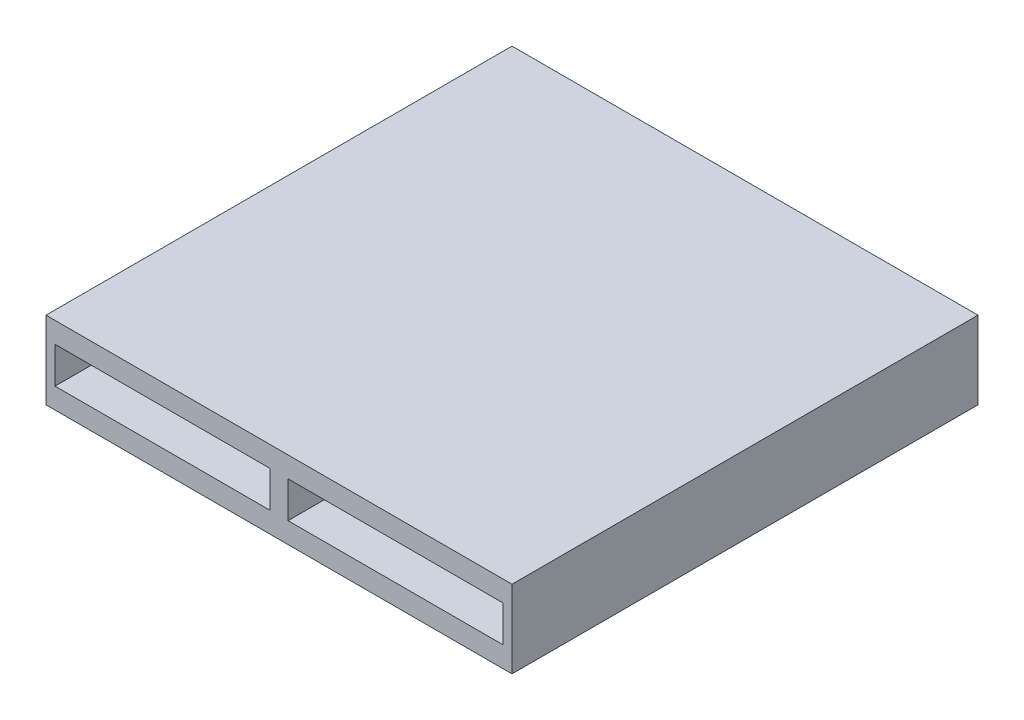
ISO-10303-21;
HEADER;
FILE_DESCRIPTION(('STEP AP214'),'2;1');
FILE_NAME('part.step','',(''),(''),'','','');
FILE_SCHEMA(('AUTOMOTIVE_DESIGN { 1 0 10303 214 1 1 1 1 }'));
ENDSEC;
DATA;
#1=APPLICATION_CONTEXT('core data for automotive mechanical design processes');
#2=APPLICATION_PROTOCOL_DEFINITION('international standard','automotive_design',2000,#1);
#3=PRODUCT_CONTEXT('',#1,'mechanical');
#4=PRODUCT('Part','Part','',(#3));
#5=PRODUCT_RELATED_PRODUCT_CATEGORY('part','',(#4));
#6=PRODUCT_DEFINITION_FORMATION('','',#4);
#7=PRODUCT_DEFINITION_CONTEXT('part definition',#1,'design');
#8=PRODUCT_DEFINITION('design','',#6,#7);
#9=PRODUCT_DEFINITION_SHAPE('','',#8);
#10=(LENGTH_UNIT() NAMED_UNIT(*) SI_UNIT(.MILLI.,.METRE.));
#11=(NAMED_UNIT(*) PLANE_ANGLE_UNIT() SI_UNIT($,.RADIAN.));
#12=(NAMED_UNIT(*) SI_UNIT($,.STERADIAN.) SOLID_ANGLE_UNIT());
#13=UNCERTAINTY_MEASURE_WITH_UNIT(LENGTH_MEASURE(1.E-05),#10,'distance_accuracy_value','');
#14=(GEOMETRIC_REPRESENTATION_CONTEXT(3) GLOBAL_UNCERTAINTY_ASSIGNED_CONTEXT((#13)) GLOBAL_UNIT_ASSIGNED_CONTEXT((#10,
#11,#12)) REPRESENTATION_CONTEXT('',''));
#15=CARTESIAN_POINT('',(0.,0.,0.));
#16=DIRECTION('',(0.,0.,1.));
#17=DIRECTION('',(1.,0.,0.));
#18=AXIS2_PLACEMENT_3D('',#15,#16,#17);
#19=CARTESIAN_POINT('',(45.,15.,-45.));
#20=DIRECTION('',(-1.,0.,0.));
#21=DIRECTION('',(0.,0.,1.));
#22=AXIS2_PLACEMENT_3D('',#19,#20,#21);
#23=PLANE('',#22);
#24=DIRECTION('',(0.,0.,-1.));
#25=VECTOR('',#24,1.);
#26=CARTESIAN_POINT('',(45.,0.,-45.));
#27=LINE('',#26,#25);
#28=CARTESIAN_POINT('',(45.,0.,45.));
#29=VERTEX_POINT('',#28);
#30=CARTESIAN_POINT('',(45.,0.,-45.));
#31=VERTEX_POINT('',#30);
#32=EDGE_CURVE('E159',#29,#31,#27,.T.);
#33=ORIENTED_EDGE('',*,*,#32,.T.);
#34=DIRECTION('',(0.,-1.,0.));
#35=VECTOR('',#34,1.);
#36=CARTESIAN_POINT('',(45.,15.,-45.));
#37=LINE('',#36,#35);
#38=CARTESIAN_POINT('',(45.,15.,-45.));
#39=VERTEX_POINT('',#38);
#40=EDGE_CURVE('E11',#39,#31,#37,.T.);
#41=ORIENTED_EDGE('',*,*,#40,.F.);
#42=DIRECTION('',(0.,0.,-1.));
#43=VECTOR('',#42,1.);
#44=CARTESIAN_POINT('',(45.,15.,-45.));
#45=LINE('',#44,#43);
#46=CARTESIAN_POINT('',(45.,15.,45.));
#47=VERTEX_POINT('',#46);
#48=EDGE_CURVE('E192',#47,#39,#45,.T.);
#49=ORIENTED_EDGE('',*,*,#48,.F.);
#50=DIRECTION('',(0.,-1.,0.));
#51=VECTOR('',#50,1.);
#52=CARTESIAN_POINT('',(45.,15.,45.));
#53=LINE('',#52,#51);
#54=EDGE_CURVE('E202',#47,#29,#53,.T.);
#55=ORIENTED_EDGE('',*,*,#54,.T.);
#56=EDGE_LOOP('',(#33,#41,#49,#55));
#57=FACE_BOUND('',#56,.T.);
#58=ADVANCED_FACE('F33',(#57),#23,.F.);
#59=CARTESIAN_POINT('',(-45.,15.,-45.));
#60=DIRECTION('',(0.,0.,1.));
#61=DIRECTION('',(1.,0.,0.));
#62=AXIS2_PLACEMENT_3D('',#59,#60,#61);
#63=PLANE('',#62);
#64=DIRECTION('',(-1.,0.,0.));
#65=VECTOR('',#64,1.);
#66=CARTESIAN_POINT('',(-43.25,11.,-45.));
#67=LINE('',#66,#65);
#68=CARTESIAN_POINT('',(-1.75,11.,-45.));
#69=VERTEX_POINT('',#68);
#70=CARTESIAN_POINT('',(-43.25,11.,-45.));
#71=VERTEX_POINT('',#70);
#72=EDGE_CURVE('E133',#69,#71,#67,.T.);
#73=ORIENTED_EDGE('',*,*,#72,.T.);
#74=DIRECTION('',(0.,-1.,0.));
#75=VECTOR('',#74,1.);
#76=CARTESIAN_POINT('',(-43.25,11.,-45.));
#77=LINE('',#76,#75);
#78=CARTESIAN_POINT('',(-43.25,4.,-45.));
#79=VERTEX_POINT('',#78);
#80=EDGE_CURVE('E125',#71,#79,#77,.T.);
#81=ORIENTED_EDGE('',*,*,#80,.T.);
#82=DIRECTION('',(1.,0.,0.));
#83=VECTOR('',#82,1.);
#84=CARTESIAN_POINT('',(-43.25,4.,-45.));
#85=LINE('',#84,#83);
#86=CARTESIAN_POINT('',(-1.75,4.,-45.));
#87=VERTEX_POINT('',#86);
#88=EDGE_CURVE('E136',#79,#87,#85,.T.);
#89=ORIENTED_EDGE('',*,*,#88,.T.);
#90=DIRECTION('',(0.,1.,0.));
#91=VECTOR('',#90,1.);
#92=CARTESIAN_POINT('',(-1.75,11.,-45.));
#93=LINE('',#92,#91);
#94=EDGE_CURVE('E47',#87,#69,#93,.T.);
#95=ORIENTED_EDGE('',*,*,#94,.T.);
#96=EDGE_LOOP('',(#73,#81,#89,#95));
#97=FACE_BOUND('',#96,.T.);
#98=DIRECTION('',(-1.,0.,0.));
#99=VECTOR('',#98,1.);
#100=CARTESIAN_POINT('',(1.75,11.,-45.));
#101=LINE('',#100,#99);
#102=CARTESIAN_POINT('',(43.25,11.,-45.));
#103=VERTEX_POINT('',#102);
#104=CARTESIAN_POINT('',(1.75,11.,-45.));
#105=VERTEX_POINT('',#104);
#106=EDGE_CURVE('E171',#103,#105,#101,.T.);
#107=ORIENTED_EDGE('',*,*,#106,.T.);
#108=DIRECTION('',(0.,-1.,0.));
#109=VECTOR('',#108,1.);
#110=CARTESIAN_POINT('',(1.75,11.,-45.));
#111=LINE('',#110,#109);
#112=CARTESIAN_POINT('',(1.75,4.,-45.));
#113=VERTEX_POINT('',#112);
#114=EDGE_CURVE('E163',#105,#113,#111,.T.);
#115=ORIENTED_EDGE('',*,*,#114,.T.);
#116=DIRECTION('',(1.,0.,0.));
#117=VECTOR('',#116,1.);
#118=CARTESIAN_POINT('',(1.75,4.,-45.));
#119=LINE('',#118,#117);
#120=CARTESIAN_POINT('',(43.25,4.,-45.));
#121=VERTEX_POINT('',#120);
#122=EDGE_CURVE('E166',#113,#121,#119,.T.);
#123=ORIENTED_EDGE('',*,*,#122,.T.);
#124=DIRECTION('',(0.,1.,0.));
#125=VECTOR('',#124,1.);
#126=CARTESIAN_POINT('',(43.25,11.,-45.));
#127=LINE('',#126,#125);
#128=EDGE_CURVE('E55',#121,#103,#127,.T.);
#129=ORIENTED_EDGE('',*,*,#128,.T.);
#130=EDGE_LOOP('',(#107,#115,#123,#129));
#131=FACE_BOUND('',#130,.T.);
#132=DIRECTION('',(-1.,0.,0.));
#133=VECTOR('',#132,1.);
#134=CARTESIAN_POINT('',(-45.,0.,-45.));
#135=LINE('',#134,#133);
#136=CARTESIAN_POINT('',(-45.,0.,-45.));
#137=VERTEX_POINT('',#136);
#138=EDGE_CURVE('E205',#31,#137,#135,.T.);
#139=ORIENTED_EDGE('',*,*,#138,.T.);
#140=DIRECTION('',(0.,-1.,0.));
#141=VECTOR('',#140,1.);
#142=CARTESIAN_POINT('',(-45.,15.,-45.));
#143=LINE('',#142,#141);
#144=CARTESIAN_POINT('',(-45.,15.,-45.));
#145=VERTEX_POINT('',#144);
#146=EDGE_CURVE('E40',#145,#137,#143,.T.);
#147=ORIENTED_EDGE('',*,*,#146,.F.);
#148=DIRECTION('',(-1.,0.,0.));
#149=VECTOR('',#148,1.);
#150=CARTESIAN_POINT('',(-45.,15.,-45.));
#151=LINE('',#150,#149);
#152=EDGE_CURVE('E195',#39,#145,#151,.T.);
#153=ORIENTED_EDGE('',*,*,#152,.F.);
#154=ORIENTED_EDGE('',*,*,#40,.T.);
#155=EDGE_LOOP('',(#139,#147,#153,#154));
#156=FACE_BOUND('',#155,.T.);
#157=ADVANCED_FACE('F140',(#97,#131,#156),#63,.F.);
#158=CARTESIAN_POINT('',(-45.,15.,-45.));
#159=DIRECTION('',(1.,0.,0.));
#160=DIRECTION('',(0.,0.,-1.));
#161=AXIS2_PLACEMENT_3D('',#158,#159,#160);
#162=PLANE('',#161);
#163=DIRECTION('',(0.,0.,1.));
#164=VECTOR('',#163,1.);
#165=CARTESIAN_POINT('',(-45.,0.,-45.));
#166=LINE('',#165,#164);
#167=CARTESIAN_POINT('',(-45.,0.,45.));
#168=VERTEX_POINT('',#167);
#169=EDGE_CURVE('E207',#137,#168,#166,.T.);
#170=ORIENTED_EDGE('',*,*,#169,.T.);
#171=DIRECTION('',(0.,-1.,0.));
#172=VECTOR('',#171,1.);
#173=CARTESIAN_POINT('',(-45.,15.,45.));
#174=LINE('',#173,#172);
#175=CARTESIAN_POINT('',(-45.,15.,45.));
#176=VERTEX_POINT('',#175);
#177=EDGE_CURVE('E212',#176,#168,#174,.T.);
#178=ORIENTED_EDGE('',*,*,#177,.F.);
#179=DIRECTION('',(0.,0.,1.));
#180=VECTOR('',#179,1.);
#181=CARTESIAN_POINT('',(-45.,15.,-45.));
#182=LINE('',#181,#180);
#183=EDGE_CURVE('E198',#145,#176,#182,.T.);
#184=ORIENTED_EDGE('',*,*,#183,.F.);
#185=ORIENTED_EDGE('',*,*,#146,.T.);
#186=EDGE_LOOP('',(#170,#178,#184,#185));
#187=FACE_BOUND('',#186,.T.);
#188=ADVANCED_FACE('F219',(#187),#162,.F.);
#189=CARTESIAN_POINT('',(-45.,15.,45.));
#190=DIRECTION('',(0.,0.,-1.));
#191=DIRECTION('',(-1.,0.,0.));
#192=AXIS2_PLACEMENT_3D('',#189,#190,#191);
#193=PLANE('',#192);
#194=DIRECTION('',(1.,0.,0.));
#195=VECTOR('',#194,1.);
#196=CARTESIAN_POINT('',(-43.25,4.,45.));
#197=LINE('',#196,#195);
#198=CARTESIAN_POINT('',(-43.25,4.,45.));
#199=VERTEX_POINT('',#198);
#200=CARTESIAN_POINT('',(-1.75,4.,45.));
#201=VERTEX_POINT('',#200);
#202=EDGE_CURVE('E152',#199,#201,#197,.T.);
#203=ORIENTED_EDGE('',*,*,#202,.F.);
#204=DIRECTION('',(0.,-1.,0.));
#205=VECTOR('',#204,1.);
#206=CARTESIAN_POINT('',(-43.25,11.,45.));
#207=LINE('',#206,#205);
#208=CARTESIAN_POINT('',(-43.25,11.,45.));
#209=VERTEX_POINT('',#208);
#210=EDGE_CURVE('E128',#209,#199,#207,.T.);
#211=ORIENTED_EDGE('',*,*,#210,.F.);
#212=DIRECTION('',(-1.,0.,0.));
#213=VECTOR('',#212,1.);
#214=CARTESIAN_POINT('',(-43.25,11.,45.));
#215=LINE('',#214,#213);
#216=CARTESIAN_POINT('',(-1.75,11.,45.));
#217=VERTEX_POINT('',#216);
#218=EDGE_CURVE('E143',#217,#209,#215,.T.);
#219=ORIENTED_EDGE('',*,*,#218,.F.);
#220=DIRECTION('',(0.,1.,0.));
#221=VECTOR('',#220,1.);
#222=CARTESIAN_POINT('',(-1.75,11.,45.));
#223=LINE('',#222,#221);
#224=EDGE_CURVE('E146',#201,#217,#223,.T.);
#225=ORIENTED_EDGE('',*,*,#224,.F.);
#226=EDGE_LOOP('',(#203,#211,#219,#225));
#227=FACE_BOUND('',#226,.T.);
#228=DIRECTION('',(1.,0.,0.));
#229=VECTOR('',#228,1.);
#230=CARTESIAN_POINT('',(1.75,4.,45.));
#231=LINE('',#230,#229);
#232=CARTESIAN_POINT('',(1.75,4.,45.));
#233=VERTEX_POINT('',#232);
#234=CARTESIAN_POINT('',(43.25,4.,45.));
#235=VERTEX_POINT('',#234);
#236=EDGE_CURVE('E177',#233,#235,#231,.T.);
#237=ORIENTED_EDGE('',*,*,#236,.F.);
#238=DIRECTION('',(0.,-1.,0.));
#239=VECTOR('',#238,1.);
#240=CARTESIAN_POINT('',(1.75,11.,45.));
#241=LINE('',#240,#239);
#242=CARTESIAN_POINT('',(1.75,11.,45.));
#243=VERTEX_POINT('',#242);
#244=EDGE_CURVE('E175',#243,#233,#241,.T.);
#245=ORIENTED_EDGE('',*,*,#244,.F.);
#246=DIRECTION('',(-1.,0.,0.));
#247=VECTOR('',#246,1.);
#248=CARTESIAN_POINT('',(1.75,11.,45.));
#249=LINE('',#248,#247);
#250=CARTESIAN_POINT('',(43.25,11.,45.));
#251=VERTEX_POINT('',#250);
#252=EDGE_CURVE('E167',#251,#243,#249,.T.);
#253=ORIENTED_EDGE('',*,*,#252,.F.);
#254=DIRECTION('',(0.,1.,0.));
#255=VECTOR('',#254,1.);
#256=CARTESIAN_POINT('',(43.25,11.,45.));
#257=LINE('',#256,#255);
#258=EDGE_CURVE('E180',#235,#251,#257,.T.);
#259=ORIENTED_EDGE('',*,*,#258,.F.);
#260=EDGE_LOOP('',(#237,#245,#253,#259));
#261=FACE_BOUND('',#260,.T.);
#262=DIRECTION('',(1.,0.,0.));
#263=VECTOR('',#262,1.);
#264=CARTESIAN_POINT('',(-45.,0.,45.));
#265=LINE('',#264,#263);
#266=EDGE_CURVE('E196',#168,#29,#265,.T.);
#267=ORIENTED_EDGE('',*,*,#266,.T.);
#268=ORIENTED_EDGE('',*,*,#54,.F.);
#269=DIRECTION('',(1.,0.,0.));
#270=VECTOR('',#269,1.);
#271=CARTESIAN_POINT('',(-45.,15.,45.));
#272=LINE('',#271,#270);
#273=EDGE_CURVE('E200',#176,#47,#272,.T.);
#274=ORIENTED_EDGE('',*,*,#273,.F.);
#275=ORIENTED_EDGE('',*,*,#177,.T.);
#276=EDGE_LOOP('',(#267,#268,#274,#275));
#277=FACE_BOUND('',#276,.T.);
#278=ADVANCED_FACE('F228',(#227,#261,#277),#193,.F.);
#279=CARTESIAN_POINT('',(0.,15.,0.));
#280=DIRECTION('',(0.,1.,0.));
#281=DIRECTION('',(0.,0.,1.));
#282=AXIS2_PLACEMENT_3D('',#279,#280,#281);
#283=PLANE('',#282);
#284=ORIENTED_EDGE('',*,*,#48,.T.);
#285=ORIENTED_EDGE('',*,*,#152,.T.);
#286=ORIENTED_EDGE('',*,*,#183,.T.);
#287=ORIENTED_EDGE('',*,*,#273,.T.);
#288=EDGE_LOOP('',(#284,#285,#286,#287));
#289=FACE_BOUND('',#288,.T.);
#290=ADVANCED_FACE('F234',(#289),#283,.T.);
#291=CARTESIAN_POINT('',(0.,0.,0.));
#292=DIRECTION('',(0.,1.,0.));
#293=DIRECTION('',(0.,0.,1.));
#294=AXIS2_PLACEMENT_3D('',#291,#292,#293);
#295=PLANE('',#294);
#296=ORIENTED_EDGE('',*,*,#32,.F.);
#297=ORIENTED_EDGE('',*,*,#266,.F.);
#298=ORIENTED_EDGE('',*,*,#169,.F.);
#299=ORIENTED_EDGE('',*,*,#138,.F.);
#300=EDGE_LOOP('',(#296,#297,#298,#299));
#301=FACE_BOUND('',#300,.T.);
#302=ADVANCED_FACE('F225',(#301),#295,.F.);
#303=CARTESIAN_POINT('',(1.75,11.,-45.));
#304=DIRECTION('',(-1.,0.,0.));
#305=DIRECTION('',(0.,0.,1.));
#306=AXIS2_PLACEMENT_3D('',#303,#304,#305);
#307=PLANE('',#306);
#308=ORIENTED_EDGE('',*,*,#244,.T.);
#309=DIRECTION('',(0.,0.,1.));
#310=VECTOR('',#309,1.);
#311=CARTESIAN_POINT('',(1.75,4.,-45.));
#312=LINE('',#311,#310);
#313=EDGE_CURVE('E174',#113,#233,#312,.T.);
#314=ORIENTED_EDGE('',*,*,#313,.F.);
#315=ORIENTED_EDGE('',*,*,#114,.F.);
#316=DIRECTION('',(0.,0.,1.));
#317=VECTOR('',#316,1.);
#318=CARTESIAN_POINT('',(1.75,11.,-45.));
#319=LINE('',#318,#317);
#320=EDGE_CURVE('E153',#105,#243,#319,.T.);
#321=ORIENTED_EDGE('',*,*,#320,.T.);
#322=EDGE_LOOP('',(#308,#314,#315,#321));
#323=FACE_BOUND('',#322,.T.);
#324=ADVANCED_FACE('F247',(#323),#307,.F.);
#325=CARTESIAN_POINT('',(1.75,11.,-45.));
#326=DIRECTION('',(0.,1.,0.));
#327=DIRECTION('',(0.,0.,1.));
#328=AXIS2_PLACEMENT_3D('',#325,#326,#327);
#329=PLANE('',#328);
#330=ORIENTED_EDGE('',*,*,#252,.T.);
#331=ORIENTED_EDGE('',*,*,#320,.F.);
#332=ORIENTED_EDGE('',*,*,#106,.F.);
#333=DIRECTION('',(0.,0.,1.));
#334=VECTOR('',#333,1.);
#335=CARTESIAN_POINT('',(43.25,11.,-45.));
#336=LINE('',#335,#334);
#337=EDGE_CURVE('E186',#103,#251,#336,.T.);
#338=ORIENTED_EDGE('',*,*,#337,.T.);
#339=EDGE_LOOP('',(#330,#331,#332,#338));
#340=FACE_BOUND('',#339,.T.);
#341=ADVANCED_FACE('F252',(#340),#329,.F.);
#342=CARTESIAN_POINT('',(43.25,11.,-45.));
#343=DIRECTION('',(1.,0.,0.));
#344=DIRECTION('',(0.,0.,-1.));
#345=AXIS2_PLACEMENT_3D('',#342,#343,#344);
#346=PLANE('',#345);
#347=ORIENTED_EDGE('',*,*,#258,.T.);
#348=ORIENTED_EDGE('',*,*,#337,.F.);
#349=ORIENTED_EDGE('',*,*,#128,.F.);
#350=DIRECTION('',(0.,0.,1.));
#351=VECTOR('',#350,1.);
#352=CARTESIAN_POINT('',(43.25,4.,-45.));
#353=LINE('',#352,#351);
#354=EDGE_CURVE('E188',#121,#235,#353,.T.);
#355=ORIENTED_EDGE('',*,*,#354,.T.);
#356=EDGE_LOOP('',(#347,#348,#349,#355));
#357=FACE_BOUND('',#356,.T.);
#358=ADVANCED_FACE('F257',(#357),#346,.F.);
#359=CARTESIAN_POINT('',(1.75,4.,-45.));
#360=DIRECTION('',(0.,-1.,0.));
#361=DIRECTION('',(0.,0.,-1.));
#362=AXIS2_PLACEMENT_3D('',#359,#360,#361);
#363=PLANE('',#362);
#364=ORIENTED_EDGE('',*,*,#236,.T.);
#365=ORIENTED_EDGE('',*,*,#354,.F.);
#366=ORIENTED_EDGE('',*,*,#122,.F.);
#367=ORIENTED_EDGE('',*,*,#313,.T.);
#368=EDGE_LOOP('',(#364,#365,#366,#367));
#369=FACE_BOUND('',#368,.T.);
#370=ADVANCED_FACE('F254',(#369),#363,.F.);
#371=CARTESIAN_POINT('',(-43.25,11.,-45.));
#372=DIRECTION('',(-1.,0.,0.));
#373=DIRECTION('',(0.,0.,1.));
#374=AXIS2_PLACEMENT_3D('',#371,#372,#373);
#375=PLANE('',#374);
#376=ORIENTED_EDGE('',*,*,#210,.T.);
#377=DIRECTION('',(0.,0.,1.));
#378=VECTOR('',#377,1.);
#379=CARTESIAN_POINT('',(-43.25,4.,-45.));
#380=LINE('',#379,#378);
#381=EDGE_CURVE('E121',#79,#199,#380,.T.);
#382=ORIENTED_EDGE('',*,*,#381,.F.);
#383=ORIENTED_EDGE('',*,*,#80,.F.);
#384=DIRECTION('',(0.,0.,1.));
#385=VECTOR('',#384,1.);
#386=CARTESIAN_POINT('',(-43.25,11.,-45.));
#387=LINE('',#386,#385);
#388=EDGE_CURVE('E157',#71,#209,#387,.T.);
#389=ORIENTED_EDGE('',*,*,#388,.T.);
#390=EDGE_LOOP('',(#376,#382,#383,#389));
#391=FACE_BOUND('',#390,.T.);
#392=ADVANCED_FACE('F123',(#391),#375,.F.);
#393=CARTESIAN_POINT('',(-43.25,11.,-45.));
#394=DIRECTION('',(0.,1.,0.));
#395=DIRECTION('',(0.,0.,1.));
#396=AXIS2_PLACEMENT_3D('',#393,#394,#395);
#397=PLANE('',#396);
#398=ORIENTED_EDGE('',*,*,#218,.T.);
#399=ORIENTED_EDGE('',*,*,#388,.F.);
#400=ORIENTED_EDGE('',*,*,#72,.F.);
#401=DIRECTION('',(0.,0.,1.));
#402=VECTOR('',#401,1.);
#403=CARTESIAN_POINT('',(-1.75,11.,-45.));
#404=LINE('',#403,#402);
#405=EDGE_CURVE('E160',#69,#217,#404,.T.);
#406=ORIENTED_EDGE('',*,*,#405,.T.);
#407=EDGE_LOOP('',(#398,#399,#400,#406));
#408=FACE_BOUND('',#407,.T.);
#409=ADVANCED_FACE('F266',(#408),#397,.F.);
#410=CARTESIAN_POINT('',(-1.75,11.,-45.));
#411=DIRECTION('',(1.,0.,0.));
#412=DIRECTION('',(0.,0.,-1.));
#413=AXIS2_PLACEMENT_3D('',#410,#411,#412);
#414=PLANE('',#413);
#415=ORIENTED_EDGE('',*,*,#224,.T.);
#416=ORIENTED_EDGE('',*,*,#405,.F.);
#417=ORIENTED_EDGE('',*,*,#94,.F.);
#418=DIRECTION('',(0.,0.,1.));
#419=VECTOR('',#418,1.);
#420=CARTESIAN_POINT('',(-1.75,4.,-45.));
#421=LINE('',#420,#419);
#422=EDGE_CURVE('E132',#87,#201,#421,.T.);
#423=ORIENTED_EDGE('',*,*,#422,.T.);
#424=EDGE_LOOP('',(#415,#416,#417,#423));
#425=FACE_BOUND('',#424,.T.);
#426=ADVANCED_FACE('F269',(#425),#414,.F.);
#427=CARTESIAN_POINT('',(-43.25,4.,-45.));
#428=DIRECTION('',(0.,-1.,0.));
#429=DIRECTION('',(0.,0.,-1.));
#430=AXIS2_PLACEMENT_3D('',#427,#428,#429);
#431=PLANE('',#430);
#432=ORIENTED_EDGE('',*,*,#202,.T.);
#433=ORIENTED_EDGE('',*,*,#422,.F.);
#434=ORIENTED_EDGE('',*,*,#88,.F.);
#435=ORIENTED_EDGE('',*,*,#381,.T.);
#436=EDGE_LOOP('',(#432,#433,#434,#435));
#437=FACE_BOUND('',#436,.T.);
#438=ADVANCED_FACE('F137',(#437),#431,.F.);
#439=CLOSED_SHELL('',(#58,#157,#188,#278,#290,#302,#324,#341,#358,#370,#392,#409,#426,#438));
#440=MANIFOLD_SOLID_BREP('B2',#439);
#441=ADVANCED_BREP_SHAPE_REPRESENTATION('',(#18,#440),#14);
#442=SHAPE_DEFINITION_REPRESENTATION(#9,#441);
ENDSEC;
END-ISO-10303-21;
